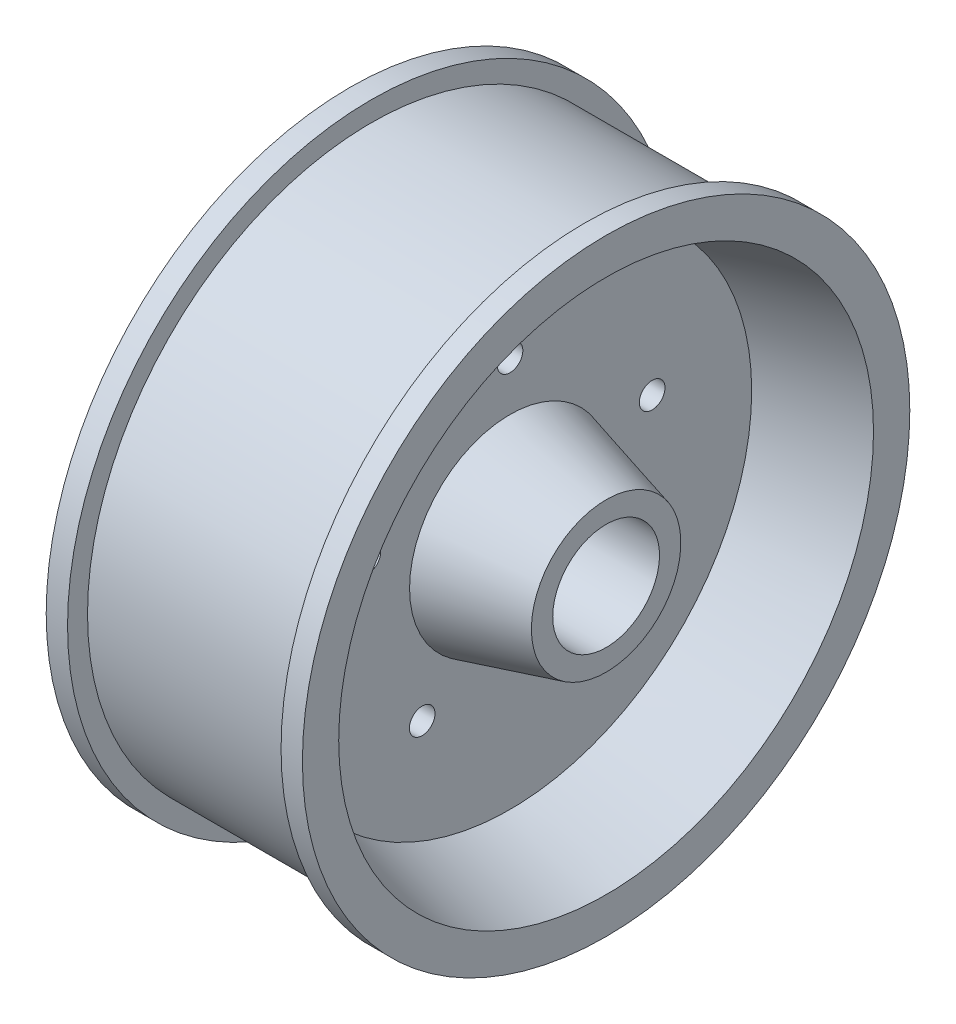
ISO-10303-21;
HEADER;
FILE_DESCRIPTION(('STEP AP214'),'2;1');
FILE_NAME('part.step','',(''),(''),'','','');
FILE_SCHEMA(('AUTOMOTIVE_DESIGN { 1 0 10303 214 1 1 1 1 }'));
ENDSEC;
DATA;
#1=APPLICATION_CONTEXT('core data for automotive mechanical design processes');
#2=APPLICATION_PROTOCOL_DEFINITION('international standard','automotive_design',2000,#1);
#3=PRODUCT_CONTEXT('',#1,'mechanical');
#4=PRODUCT('Part','Part','',(#3));
#5=PRODUCT_RELATED_PRODUCT_CATEGORY('part','',(#4));
#6=PRODUCT_DEFINITION_FORMATION('','',#4);
#7=PRODUCT_DEFINITION_CONTEXT('part definition',#1,'design');
#8=PRODUCT_DEFINITION('design','',#6,#7);
#9=PRODUCT_DEFINITION_SHAPE('','',#8);
#10=(LENGTH_UNIT() NAMED_UNIT(*) SI_UNIT(.MILLI.,.METRE.));
#11=(NAMED_UNIT(*) PLANE_ANGLE_UNIT() SI_UNIT($,.RADIAN.));
#12=(NAMED_UNIT(*) SI_UNIT($,.STERADIAN.) SOLID_ANGLE_UNIT());
#13=UNCERTAINTY_MEASURE_WITH_UNIT(LENGTH_MEASURE(1.E-05),#10,'distance_accuracy_value','');
#14=(GEOMETRIC_REPRESENTATION_CONTEXT(3) GLOBAL_UNCERTAINTY_ASSIGNED_CONTEXT((#13)) GLOBAL_UNIT_ASSIGNED_CONTEXT((#10,
#11,#12)) REPRESENTATION_CONTEXT('',''));
#15=CARTESIAN_POINT('',(0.,0.,0.));
#16=DIRECTION('',(0.,0.,1.));
#17=DIRECTION('',(1.,0.,0.));
#18=AXIS2_PLACEMENT_3D('',#15,#16,#17);
#19=CARTESIAN_POINT('',(-1499.65664488017,0.,0.));
#20=DIRECTION('',(-1.,0.,0.));
#21=DIRECTION('',(0.,0.,1.));
#22=AXIS2_PLACEMENT_3D('',#19,#20,#21);
#23=CYLINDRICAL_SURFACE('',#22,90.3224000000002);
#24=CARTESIAN_POINT('',(31.7499999999999,0.,0.));
#25=DIRECTION('',(-1.,0.,0.));
#26=DIRECTION('',(0.,0.,1.));
#27=AXIS2_PLACEMENT_3D('',#24,#25,#26);
#28=CIRCLE('',#27,90.3224000000001);
#29=CARTESIAN_POINT('',(31.7499999999999,0.,90.3224000000001));
#30=VERTEX_POINT('',#29);
#31=EDGE_CURVE('E10',#30,#30,#28,.T.);
#32=ORIENTED_EDGE('',*,*,#31,.F.);
#33=EDGE_LOOP('',(#32));
#34=FACE_BOUND('',#33,.T.);
#35=CARTESIAN_POINT('',(38.1,0.,0.));
#36=DIRECTION('',(-1.,0.,0.));
#37=DIRECTION('',(0.,0.,1.));
#38=AXIS2_PLACEMENT_3D('',#35,#36,#37);
#39=CIRCLE('',#38,90.3224000000002);
#40=CARTESIAN_POINT('',(38.1,0.,90.3224000000002));
#41=VERTEX_POINT('',#40);
#42=EDGE_CURVE('E95',#41,#41,#39,.T.);
#43=ORIENTED_EDGE('',*,*,#42,.T.);
#44=EDGE_LOOP('',(#43));
#45=FACE_BOUND('',#44,.T.);
#46=ADVANCED_FACE('F43',(#34,#45),#23,.T.);
#47=CARTESIAN_POINT('',(31.75,0.,0.));
#48=DIRECTION('',(1.,0.,0.));
#49=DIRECTION('',(0.,0.,-1.));
#50=AXIS2_PLACEMENT_3D('',#47,#48,#49);
#51=PLANE('',#50);
#52=CARTESIAN_POINT('',(31.7499999999999,0.,0.));
#53=DIRECTION('',(-1.,0.,0.));
#54=DIRECTION('',(0.,0.,1.));
#55=AXIS2_PLACEMENT_3D('',#52,#53,#54);
#56=CIRCLE('',#55,84.3806814814478);
#57=CARTESIAN_POINT('',(31.7499999999999,0.,84.3806814814478));
#58=VERTEX_POINT('',#57);
#59=EDGE_CURVE('E49',#58,#58,#56,.T.);
#60=ORIENTED_EDGE('',*,*,#59,.F.);
#61=EDGE_LOOP('',(#60));
#62=FACE_BOUND('',#61,.T.);
#63=ORIENTED_EDGE('',*,*,#31,.T.);
#64=EDGE_LOOP('',(#63));
#65=FACE_BOUND('',#64,.T.);
#66=ADVANCED_FACE('F172',(#62,#65),#51,.F.);
#67=CARTESIAN_POINT('',(-1499.65664488017,0.,0.));
#68=DIRECTION('',(-1.,0.,0.));
#69=DIRECTION('',(0.,0.,1.));
#70=AXIS2_PLACEMENT_3D('',#67,#68,#69);
#71=CYLINDRICAL_SURFACE('',#70,84.3806814814478);
#72=ORIENTED_EDGE('',*,*,#59,.T.);
#73=EDGE_LOOP('',(#72));
#74=FACE_BOUND('',#73,.T.);
#75=CARTESIAN_POINT('',(-31.7499999999999,0.,0.));
#76=DIRECTION('',(-1.,0.,0.));
#77=DIRECTION('',(0.,0.,1.));
#78=AXIS2_PLACEMENT_3D('',#75,#76,#77);
#79=CIRCLE('',#78,84.3806814814478);
#80=CARTESIAN_POINT('',(-31.7499999999999,0.,84.3806814814478));
#81=VERTEX_POINT('',#80);
#82=EDGE_CURVE('E53',#81,#81,#79,.T.);
#83=ORIENTED_EDGE('',*,*,#82,.F.);
#84=EDGE_LOOP('',(#83));
#85=FACE_BOUND('',#84,.T.);
#86=ADVANCED_FACE('F177',(#74,#85),#71,.T.);
#87=CARTESIAN_POINT('',(-31.75,0.,0.));
#88=DIRECTION('',(1.,0.,0.));
#89=DIRECTION('',(0.,0.,-1.));
#90=AXIS2_PLACEMENT_3D('',#87,#88,#89);
#91=PLANE('',#90);
#92=ORIENTED_EDGE('',*,*,#82,.T.);
#93=EDGE_LOOP('',(#92));
#94=FACE_BOUND('',#93,.T.);
#95=CARTESIAN_POINT('',(-31.7499999999999,0.,0.));
#96=DIRECTION('',(-1.,0.,0.));
#97=DIRECTION('',(0.,0.,1.));
#98=AXIS2_PLACEMENT_3D('',#95,#96,#97);
#99=CIRCLE('',#98,90.3224000000001);
#100=CARTESIAN_POINT('',(-31.7499999999999,0.,90.3224000000001));
#101=VERTEX_POINT('',#100);
#102=EDGE_CURVE('E57',#101,#101,#99,.T.);
#103=ORIENTED_EDGE('',*,*,#102,.F.);
#104=EDGE_LOOP('',(#103));
#105=FACE_BOUND('',#104,.T.);
#106=ADVANCED_FACE('F252',(#94,#105),#91,.T.);
#107=CARTESIAN_POINT('',(-1499.65664488017,0.,0.));
#108=DIRECTION('',(-1.,0.,0.));
#109=DIRECTION('',(0.,0.,1.));
#110=AXIS2_PLACEMENT_3D('',#107,#108,#109);
#111=CYLINDRICAL_SURFACE('',#110,90.3224000000002);
#112=ORIENTED_EDGE('',*,*,#102,.T.);
#113=EDGE_LOOP('',(#112));
#114=FACE_BOUND('',#113,.T.);
#115=CARTESIAN_POINT('',(-38.1,0.,0.));
#116=DIRECTION('',(-1.,0.,0.));
#117=DIRECTION('',(0.,0.,1.));
#118=AXIS2_PLACEMENT_3D('',#115,#116,#117);
#119=CIRCLE('',#118,90.3224000000002);
#120=CARTESIAN_POINT('',(-38.1,0.,90.3224000000002));
#121=VERTEX_POINT('',#120);
#122=EDGE_CURVE('E62',#121,#121,#119,.T.);
#123=ORIENTED_EDGE('',*,*,#122,.F.);
#124=EDGE_LOOP('',(#123));
#125=FACE_BOUND('',#124,.T.);
#126=ADVANCED_FACE('F248',(#114,#125),#111,.T.);
#127=CARTESIAN_POINT('',(-38.1,0.,0.));
#128=DIRECTION('',(-1.,0.,0.));
#129=DIRECTION('',(0.,0.,1.));
#130=AXIS2_PLACEMENT_3D('',#127,#128,#129);
#131=PLANE('',#130);
#132=ORIENTED_EDGE('',*,*,#122,.T.);
#133=EDGE_LOOP('',(#132));
#134=FACE_BOUND('',#133,.T.);
#135=CARTESIAN_POINT('',(-38.1,0.,0.));
#136=DIRECTION('',(-1.,0.,0.));
#137=DIRECTION('',(0.,0.,1.));
#138=AXIS2_PLACEMENT_3D('',#135,#136,#137);
#139=CIRCLE('',#138,79.5274000000001);
#140=CARTESIAN_POINT('',(-38.1,0.,79.5274000000001));
#141=VERTEX_POINT('',#140);
#142=EDGE_CURVE('E65',#141,#141,#139,.T.);
#143=ORIENTED_EDGE('',*,*,#142,.F.);
#144=EDGE_LOOP('',(#143));
#145=FACE_BOUND('',#144,.T.);
#146=ADVANCED_FACE('F244',(#134,#145),#131,.T.);
#147=CARTESIAN_POINT('',(-9.52500000000001,0.,0.));
#148=DIRECTION('',(-1.,0.,0.));
#149=DIRECTION('',(0.,0.,1.));
#150=AXIS2_PLACEMENT_3D('',#147,#148,#149);
#151=CONICAL_SURFACE('',#150,71.870751826281,0.261799387799142);
#152=ORIENTED_EDGE('',*,*,#142,.T.);
#153=EDGE_LOOP('',(#152));
#154=FACE_BOUND('',#153,.T.);
#155=CARTESIAN_POINT('',(-9.52500000000001,0.,0.));
#156=DIRECTION('',(-1.,0.,0.));
#157=DIRECTION('',(0.,0.,1.));
#158=AXIS2_PLACEMENT_3D('',#155,#156,#157);
#159=CIRCLE('',#158,71.870751826281);
#160=CARTESIAN_POINT('',(-9.52500000000001,0.,71.870751826281));
#161=VERTEX_POINT('',#160);
#162=EDGE_CURVE('E68',#161,#161,#159,.T.);
#163=ORIENTED_EDGE('',*,*,#162,.F.);
#164=EDGE_LOOP('',(#163));
#165=FACE_BOUND('',#164,.T.);
#166=ADVANCED_FACE('F219',(#154,#165),#151,.F.);
#167=CARTESIAN_POINT('',(-9.525,0.,0.));
#168=DIRECTION('',(-1.,0.,0.));
#169=DIRECTION('',(0.,0.,1.));
#170=AXIS2_PLACEMENT_3D('',#167,#168,#169);
#171=PLANE('',#170);
#172=CARTESIAN_POINT('',(-9.525,13.7358053999663,42.2744621493196));
#173=DIRECTION('',(-1.,0.,0.));
#174=DIRECTION('',(0.,0.,1.));
#175=AXIS2_PLACEMENT_3D('',#172,#173,#174);
#176=CIRCLE('',#175,3.81);
#177=CARTESIAN_POINT('',(-9.525,13.7358053999663,46.0844621493196));
#178=VERTEX_POINT('',#177);
#179=EDGE_CURVE('E104',#178,#178,#176,.T.);
#180=ORIENTED_EDGE('',*,*,#179,.F.);
#181=EDGE_LOOP('',(#180));
#182=FACE_BOUND('',#181,.T.);
#183=CARTESIAN_POINT('',(-9.525,-35.9608053999666,26.1270544644002));
#184=DIRECTION('',(-1.,0.,0.));
#185=DIRECTION('',(0.,0.,1.));
#186=AXIS2_PLACEMENT_3D('',#183,#184,#185);
#187=CIRCLE('',#186,3.81);
#188=CARTESIAN_POINT('',(-9.525,-35.9608053999666,29.9370544644002));
#189=VERTEX_POINT('',#188);
#190=EDGE_CURVE('E107',#189,#189,#187,.T.);
#191=ORIENTED_EDGE('',*,*,#190,.F.);
#192=EDGE_LOOP('',(#191));
#193=FACE_BOUND('',#192,.T.);
#194=CARTESIAN_POINT('',(-9.525,-35.9608053999662,-26.1270544644007));
#195=DIRECTION('',(-1.,0.,0.));
#196=DIRECTION('',(0.,0.,1.));
#197=AXIS2_PLACEMENT_3D('',#194,#195,#196);
#198=CIRCLE('',#197,3.81);
#199=CARTESIAN_POINT('',(-9.525,-35.9608053999662,-22.3170544644007));
#200=VERTEX_POINT('',#199);
#201=EDGE_CURVE('E110',#200,#200,#198,.T.);
#202=ORIENTED_EDGE('',*,*,#201,.F.);
#203=EDGE_LOOP('',(#202));
#204=FACE_BOUND('',#203,.T.);
#205=CARTESIAN_POINT('',(-9.525,13.7358053999669,-42.2744621493194));
#206=DIRECTION('',(-1.,0.,0.));
#207=DIRECTION('',(0.,0.,1.));
#208=AXIS2_PLACEMENT_3D('',#205,#206,#207);
#209=CIRCLE('',#208,3.81);
#210=CARTESIAN_POINT('',(-9.525,13.7358053999669,-38.4644621493194));
#211=VERTEX_POINT('',#210);
#212=EDGE_CURVE('E113',#211,#211,#209,.T.);
#213=ORIENTED_EDGE('',*,*,#212,.F.);
#214=EDGE_LOOP('',(#213));
#215=FACE_BOUND('',#214,.T.);
#216=CARTESIAN_POINT('',(-9.525,44.45,0.));
#217=DIRECTION('',(-1.,0.,0.));
#218=DIRECTION('',(0.,0.,1.));
#219=AXIS2_PLACEMENT_3D('',#216,#217,#218);
#220=CIRCLE('',#219,3.81);
#221=CARTESIAN_POINT('',(-9.525,44.45,3.81));
#222=VERTEX_POINT('',#221);
#223=EDGE_CURVE('E98',#222,#222,#220,.T.);
#224=ORIENTED_EDGE('',*,*,#223,.F.);
#225=EDGE_LOOP('',(#224));
#226=FACE_BOUND('',#225,.T.);
#227=ORIENTED_EDGE('',*,*,#162,.T.);
#228=EDGE_LOOP('',(#227));
#229=FACE_BOUND('',#228,.T.);
#230=CARTESIAN_POINT('',(-9.52500000000001,0.,0.));
#231=DIRECTION('',(-1.,0.,0.));
#232=DIRECTION('',(0.,0.,1.));
#233=AXIS2_PLACEMENT_3D('',#230,#231,#232);
#234=CIRCLE('',#233,29.8816481737193);
#235=CARTESIAN_POINT('',(-9.52500000000001,0.,29.8816481737193));
#236=VERTEX_POINT('',#235);
#237=EDGE_CURVE('E71',#236,#236,#234,.T.);
#238=ORIENTED_EDGE('',*,*,#237,.F.);
#239=EDGE_LOOP('',(#238));
#240=FACE_BOUND('',#239,.T.);
#241=ADVANCED_FACE('F216',(#182,#193,#204,#215,#226,#229,#240),#171,.T.);
#242=CARTESIAN_POINT('',(-38.1,0.,0.));
#243=DIRECTION('',(1.,0.,0.));
#244=DIRECTION('',(0.,0.,-1.));
#245=AXIS2_PLACEMENT_3D('',#242,#243,#244);
#246=CONICAL_SURFACE('',#245,22.2250000000002,0.261799387799143);
#247=ORIENTED_EDGE('',*,*,#237,.T.);
#248=EDGE_LOOP('',(#247));
#249=FACE_BOUND('',#248,.T.);
#250=CARTESIAN_POINT('',(-38.1,0.,0.));
#251=DIRECTION('',(-1.,0.,0.));
#252=DIRECTION('',(0.,0.,1.));
#253=AXIS2_PLACEMENT_3D('',#250,#251,#252);
#254=CIRCLE('',#253,22.2250000000002);
#255=CARTESIAN_POINT('',(-38.1,0.,22.2250000000002));
#256=VERTEX_POINT('',#255);
#257=EDGE_CURVE('E74',#256,#256,#254,.T.);
#258=ORIENTED_EDGE('',*,*,#257,.F.);
#259=EDGE_LOOP('',(#258));
#260=FACE_BOUND('',#259,.T.);
#261=ADVANCED_FACE('F168',(#249,#260),#246,.T.);
#262=CARTESIAN_POINT('',(-38.1,0.,0.));
#263=DIRECTION('',(-1.,0.,0.));
#264=DIRECTION('',(0.,0.,1.));
#265=AXIS2_PLACEMENT_3D('',#262,#263,#264);
#266=PLANE('',#265);
#267=ORIENTED_EDGE('',*,*,#257,.T.);
#268=EDGE_LOOP('',(#267));
#269=FACE_BOUND('',#268,.T.);
#270=CARTESIAN_POINT('',(-38.1,0.,0.));
#271=DIRECTION('',(-1.,0.,0.));
#272=DIRECTION('',(0.,0.,1.));
#273=AXIS2_PLACEMENT_3D('',#270,#271,#272);
#274=CIRCLE('',#273,15.8750000000002);
#275=CARTESIAN_POINT('',(-38.1,0.,15.8750000000002));
#276=VERTEX_POINT('',#275);
#277=EDGE_CURVE('E77',#276,#276,#274,.T.);
#278=ORIENTED_EDGE('',*,*,#277,.F.);
#279=EDGE_LOOP('',(#278));
#280=FACE_BOUND('',#279,.T.);
#281=ADVANCED_FACE('F162',(#269,#280),#266,.T.);
#282=CARTESIAN_POINT('',(-1499.65664488017,0.,0.));
#283=DIRECTION('',(-1.,0.,0.));
#284=DIRECTION('',(0.,0.,1.));
#285=AXIS2_PLACEMENT_3D('',#282,#283,#284);
#286=CYLINDRICAL_SURFACE('',#285,15.8750000000002);
#287=ORIENTED_EDGE('',*,*,#277,.T.);
#288=EDGE_LOOP('',(#287));
#289=FACE_BOUND('',#288,.T.);
#290=CARTESIAN_POINT('',(38.1,0.,0.));
#291=DIRECTION('',(-1.,0.,0.));
#292=DIRECTION('',(0.,0.,1.));
#293=AXIS2_PLACEMENT_3D('',#290,#291,#292);
#294=CIRCLE('',#293,15.8750000000002);
#295=CARTESIAN_POINT('',(38.1,0.,15.8750000000002));
#296=VERTEX_POINT('',#295);
#297=EDGE_CURVE('E80',#296,#296,#294,.T.);
#298=ORIENTED_EDGE('',*,*,#297,.F.);
#299=EDGE_LOOP('',(#298));
#300=FACE_BOUND('',#299,.T.);
#301=ADVANCED_FACE('F157',(#289,#300),#286,.F.);
#302=CARTESIAN_POINT('',(38.1,-2.08166817117215E-13,0.));
#303=DIRECTION('',(-1.,0.,0.));
#304=DIRECTION('',(0.,0.,1.));
#305=AXIS2_PLACEMENT_3D('',#302,#303,#304);
#306=PLANE('',#305);
#307=CARTESIAN_POINT('',(38.1,0.,0.));
#308=DIRECTION('',(-1.,0.,0.));
#309=DIRECTION('',(0.,0.,1.));
#310=AXIS2_PLACEMENT_3D('',#307,#308,#309);
#311=CIRCLE('',#310,22.2250000000002);
#312=CARTESIAN_POINT('',(38.1,0.,22.2250000000002));
#313=VERTEX_POINT('',#312);
#314=EDGE_CURVE('E83',#313,#313,#311,.T.);
#315=ORIENTED_EDGE('',*,*,#314,.F.);
#316=EDGE_LOOP('',(#315));
#317=FACE_BOUND('',#316,.T.);
#318=ORIENTED_EDGE('',*,*,#297,.T.);
#319=EDGE_LOOP('',(#318));
#320=FACE_BOUND('',#319,.T.);
#321=ADVANCED_FACE('F151',(#317,#320),#306,.F.);
#322=CARTESIAN_POINT('',(38.1,0.,0.));
#323=DIRECTION('',(-1.,0.,0.));
#324=DIRECTION('',(0.,0.,1.));
#325=AXIS2_PLACEMENT_3D('',#322,#323,#324);
#326=CONICAL_SURFACE('',#325,22.2250000000002,0.261799387799141);
#327=CARTESIAN_POINT('',(9.52500000000001,0.,0.));
#328=DIRECTION('',(-1.,0.,0.));
#329=DIRECTION('',(0.,0.,1.));
#330=AXIS2_PLACEMENT_3D('',#327,#328,#329);
#331=CIRCLE('',#330,29.8816481737193);
#332=CARTESIAN_POINT('',(9.52500000000001,0.,29.8816481737193));
#333=VERTEX_POINT('',#332);
#334=EDGE_CURVE('E86',#333,#333,#331,.T.);
#335=ORIENTED_EDGE('',*,*,#334,.F.);
#336=EDGE_LOOP('',(#335));
#337=FACE_BOUND('',#336,.T.);
#338=ORIENTED_EDGE('',*,*,#314,.T.);
#339=EDGE_LOOP('',(#338));
#340=FACE_BOUND('',#339,.T.);
#341=ADVANCED_FACE('F135',(#337,#340),#326,.T.);
#342=CARTESIAN_POINT('',(9.525,0.,0.));
#343=DIRECTION('',(-1.,0.,0.));
#344=DIRECTION('',(0.,0.,1.));
#345=AXIS2_PLACEMENT_3D('',#342,#343,#344);
#346=PLANE('',#345);
#347=CARTESIAN_POINT('',(9.525,13.7358053999663,42.2744621493196));
#348=DIRECTION('',(1.,0.,0.));
#349=DIRECTION('',(0.,0.951056516295155,-0.309016994374945));
#350=AXIS2_PLACEMENT_3D('',#347,#348,#349);
#351=CIRCLE('',#350,3.81);
#352=CARTESIAN_POINT('',(9.525,17.3593307270508,41.0971074007511));
#353=VERTEX_POINT('',#352);
#354=EDGE_CURVE('E116',#353,#353,#351,.T.);
#355=ORIENTED_EDGE('',*,*,#354,.F.);
#356=EDGE_LOOP('',(#355));
#357=FACE_BOUND('',#356,.T.);
#358=CARTESIAN_POINT('',(9.525,-35.9608053999666,26.1270544644002));
#359=DIRECTION('',(1.,0.,0.));
#360=DIRECTION('',(0.,0.587785252292469,0.809016994374951));
#361=AXIS2_PLACEMENT_3D('',#358,#359,#360);
#362=CIRCLE('',#361,3.81);
#363=CARTESIAN_POINT('',(9.525,-33.7213435887323,29.2094092129688));
#364=VERTEX_POINT('',#363);
#365=EDGE_CURVE('E123',#364,#364,#362,.T.);
#366=ORIENTED_EDGE('',*,*,#365,.F.);
#367=EDGE_LOOP('',(#366));
#368=FACE_BOUND('',#367,.T.);
#369=CARTESIAN_POINT('',(9.525,-35.9608053999662,-26.1270544644007));
#370=DIRECTION('',(1.,0.,0.));
#371=DIRECTION('',(0.,-0.58778525229248,0.809016994374942));
#372=AXIS2_PLACEMENT_3D('',#369,#370,#371);
#373=CIRCLE('',#372,3.81);
#374=CARTESIAN_POINT('',(9.525,-38.2002672112005,-23.0446997158322));
#375=VERTEX_POINT('',#374);
#376=EDGE_CURVE('E120',#375,#375,#373,.T.);
#377=ORIENTED_EDGE('',*,*,#376,.F.);
#378=EDGE_LOOP('',(#377));
#379=FACE_BOUND('',#378,.T.);
#380=CARTESIAN_POINT('',(9.525,13.7358053999669,-42.2744621493194));
#381=DIRECTION('',(1.,0.,0.));
#382=DIRECTION('',(0.,-0.95105651629515,-0.309016994374958));
#383=AXIS2_PLACEMENT_3D('',#380,#381,#382);
#384=CIRCLE('',#383,3.81);
#385=CARTESIAN_POINT('',(9.525,10.1122800728824,-43.451816897888));
#386=VERTEX_POINT('',#385);
#387=EDGE_CURVE('E117',#386,#386,#384,.T.);
#388=ORIENTED_EDGE('',*,*,#387,.F.);
#389=EDGE_LOOP('',(#388));
#390=FACE_BOUND('',#389,.T.);
#391=CARTESIAN_POINT('',(9.525,44.45,0.));
#392=DIRECTION('',(1.,0.,0.));
#393=DIRECTION('',(0.,0.,-1.));
#394=AXIS2_PLACEMENT_3D('',#391,#392,#393);
#395=CIRCLE('',#394,3.81);
#396=CARTESIAN_POINT('',(9.525,44.45,-3.81));
#397=VERTEX_POINT('',#396);
#398=EDGE_CURVE('E101',#397,#397,#395,.T.);
#399=ORIENTED_EDGE('',*,*,#398,.F.);
#400=EDGE_LOOP('',(#399));
#401=FACE_BOUND('',#400,.T.);
#402=CARTESIAN_POINT('',(9.52500000000001,0.,0.));
#403=DIRECTION('',(-1.,0.,0.));
#404=DIRECTION('',(0.,0.,1.));
#405=AXIS2_PLACEMENT_3D('',#402,#403,#404);
#406=CIRCLE('',#405,71.870751826281);
#407=CARTESIAN_POINT('',(9.52500000000001,0.,71.870751826281));
#408=VERTEX_POINT('',#407);
#409=EDGE_CURVE('E89',#408,#408,#406,.T.);
#410=ORIENTED_EDGE('',*,*,#409,.F.);
#411=EDGE_LOOP('',(#410));
#412=FACE_BOUND('',#411,.T.);
#413=ORIENTED_EDGE('',*,*,#334,.T.);
#414=EDGE_LOOP('',(#413));
#415=FACE_BOUND('',#414,.T.);
#416=ADVANCED_FACE('F131',(#357,#368,#379,#390,#401,#412,#415),#346,.F.);
#417=CARTESIAN_POINT('',(9.52500000000001,0.,0.));
#418=DIRECTION('',(1.,0.,0.));
#419=DIRECTION('',(0.,0.,-1.));
#420=AXIS2_PLACEMENT_3D('',#417,#418,#419);
#421=CONICAL_SURFACE('',#420,71.870751826281,0.261799387799142);
#422=CARTESIAN_POINT('',(38.1,0.,0.));
#423=DIRECTION('',(-1.,0.,0.));
#424=DIRECTION('',(0.,0.,1.));
#425=AXIS2_PLACEMENT_3D('',#422,#423,#424);
#426=CIRCLE('',#425,79.5274000000001);
#427=CARTESIAN_POINT('',(38.1,0.,79.5274000000001));
#428=VERTEX_POINT('',#427);
#429=EDGE_CURVE('E92',#428,#428,#426,.T.);
#430=ORIENTED_EDGE('',*,*,#429,.F.);
#431=EDGE_LOOP('',(#430));
#432=FACE_BOUND('',#431,.T.);
#433=ORIENTED_EDGE('',*,*,#409,.T.);
#434=EDGE_LOOP('',(#433));
#435=FACE_BOUND('',#434,.T.);
#436=ADVANCED_FACE('F134',(#432,#435),#421,.F.);
#437=CARTESIAN_POINT('',(38.1,0.,0.));
#438=DIRECTION('',(-1.,0.,0.));
#439=DIRECTION('',(0.,0.,1.));
#440=AXIS2_PLACEMENT_3D('',#437,#438,#439);
#441=PLANE('',#440);
#442=ORIENTED_EDGE('',*,*,#42,.F.);
#443=EDGE_LOOP('',(#442));
#444=FACE_BOUND('',#443,.T.);
#445=ORIENTED_EDGE('',*,*,#429,.T.);
#446=EDGE_LOOP('',(#445));
#447=FACE_BOUND('',#446,.T.);
#448=ADVANCED_FACE('F182',(#444,#447),#441,.F.);
#449=CARTESIAN_POINT('',(-38.1,44.45,0.));
#450=DIRECTION('',(1.,0.,0.));
#451=DIRECTION('',(0.,0.,-1.));
#452=AXIS2_PLACEMENT_3D('',#449,#450,#451);
#453=CYLINDRICAL_SURFACE('',#452,3.81);
#454=ORIENTED_EDGE('',*,*,#223,.T.);
#455=EDGE_LOOP('',(#454));
#456=FACE_BOUND('',#455,.T.);
#457=ORIENTED_EDGE('',*,*,#398,.T.);
#458=EDGE_LOOP('',(#457));
#459=FACE_BOUND('',#458,.T.);
#460=ADVANCED_FACE('F185',(#456,#459),#453,.F.);
#461=CARTESIAN_POINT('',(-38.1,13.7358053999669,-42.2744621493194));
#462=DIRECTION('',(1.,0.,0.));
#463=DIRECTION('',(0.,0.,-1.));
#464=AXIS2_PLACEMENT_3D('',#461,#462,#463);
#465=CYLINDRICAL_SURFACE('',#464,3.81);
#466=ORIENTED_EDGE('',*,*,#212,.T.);
#467=EDGE_LOOP('',(#466));
#468=FACE_BOUND('',#467,.T.);
#469=ORIENTED_EDGE('',*,*,#387,.T.);
#470=EDGE_LOOP('',(#469));
#471=FACE_BOUND('',#470,.T.);
#472=ADVANCED_FACE('F197',(#468,#471),#465,.F.);
#473=CARTESIAN_POINT('',(-38.1,-35.9608053999662,-26.1270544644007));
#474=DIRECTION('',(1.,0.,0.));
#475=DIRECTION('',(0.,0.,-1.));
#476=AXIS2_PLACEMENT_3D('',#473,#474,#475);
#477=CYLINDRICAL_SURFACE('',#476,3.81);
#478=ORIENTED_EDGE('',*,*,#201,.T.);
#479=EDGE_LOOP('',(#478));
#480=FACE_BOUND('',#479,.T.);
#481=ORIENTED_EDGE('',*,*,#376,.T.);
#482=EDGE_LOOP('',(#481));
#483=FACE_BOUND('',#482,.T.);
#484=ADVANCED_FACE('F201',(#480,#483),#477,.F.);
#485=CARTESIAN_POINT('',(-38.1,-35.9608053999666,26.1270544644002));
#486=DIRECTION('',(1.,0.,0.));
#487=DIRECTION('',(0.,0.,-1.));
#488=AXIS2_PLACEMENT_3D('',#485,#486,#487);
#489=CYLINDRICAL_SURFACE('',#488,3.81);
#490=ORIENTED_EDGE('',*,*,#190,.T.);
#491=EDGE_LOOP('',(#490));
#492=FACE_BOUND('',#491,.T.);
#493=ORIENTED_EDGE('',*,*,#365,.T.);
#494=EDGE_LOOP('',(#493));
#495=FACE_BOUND('',#494,.T.);
#496=ADVANCED_FACE('F205',(#492,#495),#489,.F.);
#497=CARTESIAN_POINT('',(-38.1,13.7358053999663,42.2744621493196));
#498=DIRECTION('',(1.,0.,0.));
#499=DIRECTION('',(0.,0.,-1.));
#500=AXIS2_PLACEMENT_3D('',#497,#498,#499);
#501=CYLINDRICAL_SURFACE('',#500,3.81);
#502=ORIENTED_EDGE('',*,*,#179,.T.);
#503=EDGE_LOOP('',(#502));
#504=FACE_BOUND('',#503,.T.);
#505=ORIENTED_EDGE('',*,*,#354,.T.);
#506=EDGE_LOOP('',(#505));
#507=FACE_BOUND('',#506,.T.);
#508=ADVANCED_FACE('F129',(#504,#507),#501,.F.);
#509=CLOSED_SHELL('',(#46,#66,#86,#106,#126,#146,#166,#241,#261,#281,#301,#321,#341,#416,#436,
#448,#460,#472,#484,#496,#508));
#510=MANIFOLD_SOLID_BREP('B2',#509);
#511=ADVANCED_BREP_SHAPE_REPRESENTATION('',(#18,#510),#14);
#512=SHAPE_DEFINITION_REPRESENTATION(#9,#511);
ENDSEC;
END-ISO-10303-21;
